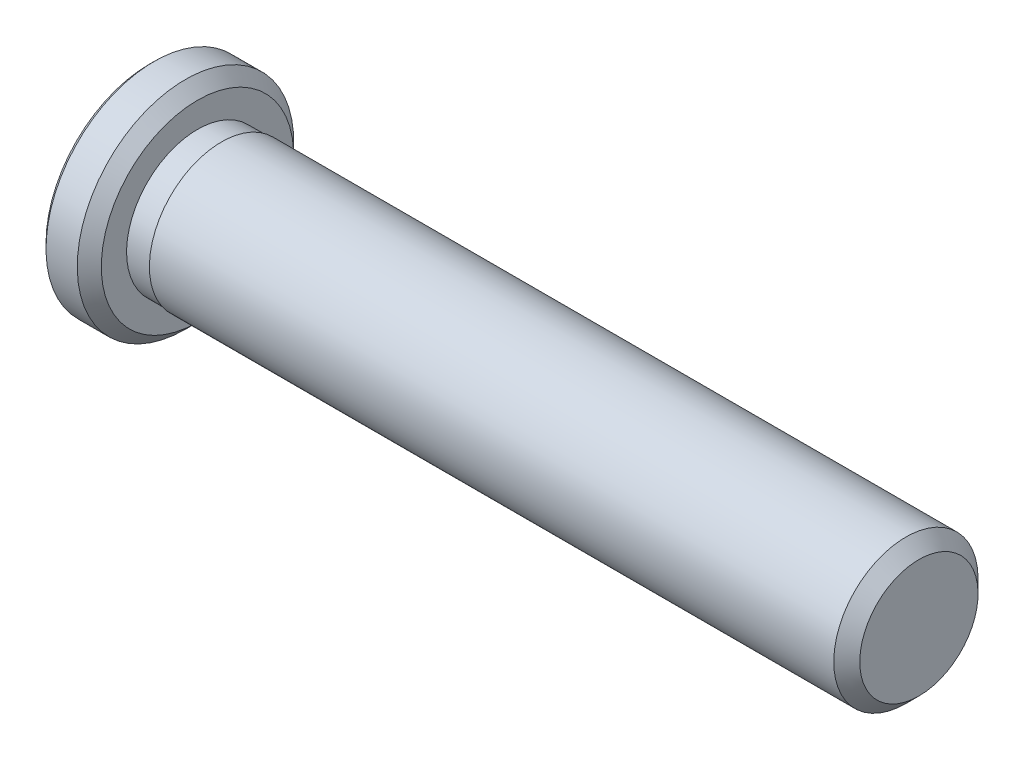
ISO-10303-21;
HEADER;
FILE_DESCRIPTION(('STEP AP214'),'2;1');
FILE_NAME('part.step','',(''),(''),'','','');
FILE_SCHEMA(('AUTOMOTIVE_DESIGN { 1 0 10303 214 1 1 1 1 }'));
ENDSEC;
DATA;
#1=APPLICATION_CONTEXT('core data for automotive mechanical design processes');
#2=APPLICATION_PROTOCOL_DEFINITION('international standard','automotive_design',2000,#1);
#3=PRODUCT_CONTEXT('',#1,'mechanical');
#4=PRODUCT('Part','Part','',(#3));
#5=PRODUCT_RELATED_PRODUCT_CATEGORY('part','',(#4));
#6=PRODUCT_DEFINITION_FORMATION('','',#4);
#7=PRODUCT_DEFINITION_CONTEXT('part definition',#1,'design');
#8=PRODUCT_DEFINITION('design','',#6,#7);
#9=PRODUCT_DEFINITION_SHAPE('','',#8);
#10=(LENGTH_UNIT() NAMED_UNIT(*) SI_UNIT(.MILLI.,.METRE.));
#11=(NAMED_UNIT(*) PLANE_ANGLE_UNIT() SI_UNIT($,.RADIAN.));
#12=(NAMED_UNIT(*) SI_UNIT($,.STERADIAN.) SOLID_ANGLE_UNIT());
#13=UNCERTAINTY_MEASURE_WITH_UNIT(LENGTH_MEASURE(1.E-05),#10,'distance_accuracy_value','');
#14=(GEOMETRIC_REPRESENTATION_CONTEXT(3) GLOBAL_UNCERTAINTY_ASSIGNED_CONTEXT((#13)) GLOBAL_UNIT_ASSIGNED_CONTEXT((#10,
#11,#12)) REPRESENTATION_CONTEXT('',''));
#15=CARTESIAN_POINT('',(0.,0.,0.));
#16=DIRECTION('',(0.,0.,1.));
#17=DIRECTION('',(1.,0.,0.));
#18=AXIS2_PLACEMENT_3D('',#15,#16,#17);
#19=CARTESIAN_POINT('',(-2.,0.,0.));
#20=DIRECTION('',(1.,0.,0.));
#21=DIRECTION('',(0.,1.,0.));
#22=AXIS2_PLACEMENT_3D('',#19,#20,#21);
#23=PLANE('',#22);
#24=DIRECTION('',(0.,0.,1.));
#25=VECTOR('',#24,1.);
#26=CARTESIAN_POINT('',(-2.,-1.5,-0.86602540378444));
#27=LINE('',#26,#25);
#28=CARTESIAN_POINT('',(-2.,-1.5,-0.86602540378444));
#29=VERTEX_POINT('',#28);
#30=CARTESIAN_POINT('',(-2.,-1.5,0.86602540378444));
#31=VERTEX_POINT('',#30);
#32=EDGE_CURVE('E105',#29,#31,#27,.T.);
#33=ORIENTED_EDGE('',*,*,#32,.F.);
#34=DIRECTION('',(0.,-0.866025403784433,0.500000000000009));
#35=VECTOR('',#34,1.);
#36=CARTESIAN_POINT('',(-2.,0.,-1.7320508075689));
#37=LINE('',#36,#35);
#38=CARTESIAN_POINT('',(-2.,0.,-1.7320508075689));
#39=VERTEX_POINT('',#38);
#40=EDGE_CURVE('E31',#39,#29,#37,.T.);
#41=ORIENTED_EDGE('',*,*,#40,.F.);
#42=DIRECTION('',(0.,-0.866025403784433,-0.500000000000009));
#43=VECTOR('',#42,1.);
#44=CARTESIAN_POINT('',(-2.,1.5,-0.86602540378444));
#45=LINE('',#44,#43);
#46=CARTESIAN_POINT('',(-2.,1.5,-0.86602540378444));
#47=VERTEX_POINT('',#46);
#48=EDGE_CURVE('E114',#47,#39,#45,.T.);
#49=ORIENTED_EDGE('',*,*,#48,.F.);
#50=DIRECTION('',(0.,0.,-1.));
#51=VECTOR('',#50,1.);
#52=CARTESIAN_POINT('',(-2.,1.5,0.86602540378444));
#53=LINE('',#52,#51);
#54=CARTESIAN_POINT('',(-2.,1.5,0.86602540378444));
#55=VERTEX_POINT('',#54);
#56=EDGE_CURVE('E112',#55,#47,#53,.T.);
#57=ORIENTED_EDGE('',*,*,#56,.F.);
#58=DIRECTION('',(0.,0.866025403784433,-0.500000000000009));
#59=VECTOR('',#58,1.);
#60=CARTESIAN_POINT('',(-2.,0.,1.7320508075689));
#61=LINE('',#60,#59);
#62=CARTESIAN_POINT('',(-2.,0.,1.7320508075689));
#63=VERTEX_POINT('',#62);
#64=EDGE_CURVE('E79',#63,#55,#61,.T.);
#65=ORIENTED_EDGE('',*,*,#64,.F.);
#66=DIRECTION('',(0.,0.866025403784433,0.500000000000009));
#67=VECTOR('',#66,1.);
#68=CARTESIAN_POINT('',(-2.,-1.5,0.86602540378444));
#69=LINE('',#68,#67);
#70=EDGE_CURVE('E108',#31,#63,#69,.T.);
#71=ORIENTED_EDGE('',*,*,#70,.F.);
#72=EDGE_LOOP('',(#33,#41,#49,#57,#65,#71));
#73=FACE_BOUND('',#72,.T.);
#74=CARTESIAN_POINT('',(-2.,0.,0.));
#75=DIRECTION('',(-1.,0.,0.));
#76=DIRECTION('',(0.,-1.,0.));
#77=AXIS2_PLACEMENT_3D('',#74,#75,#76);
#78=CIRCLE('',#77,4.3);
#79=CARTESIAN_POINT('',(-2.,-4.3,0.));
#80=VERTEX_POINT('',#79);
#81=EDGE_CURVE('E11',#80,#80,#78,.T.);
#82=ORIENTED_EDGE('',*,*,#81,.T.);
#83=EDGE_LOOP('',(#82));
#84=FACE_BOUND('',#83,.T.);
#85=ADVANCED_FACE('F17',(#73,#84),#23,.F.);
#86=CARTESIAN_POINT('',(-1.8,0.,0.));
#87=DIRECTION('',(1.,0.,0.));
#88=DIRECTION('',(0.,1.,0.));
#89=AXIS2_PLACEMENT_3D('',#86,#87,#88);
#90=CONICAL_SURFACE('',#89,4.5,0.78539816339745);
#91=ORIENTED_EDGE('',*,*,#81,.F.);
#92=EDGE_LOOP('',(#91));
#93=FACE_BOUND('',#92,.T.);
#94=CARTESIAN_POINT('',(-1.8,0.,0.));
#95=DIRECTION('',(-1.,0.,0.));
#96=DIRECTION('',(0.,-1.,0.));
#97=AXIS2_PLACEMENT_3D('',#94,#95,#96);
#98=CIRCLE('',#97,4.5);
#99=CARTESIAN_POINT('',(-1.8,-4.5,0.));
#100=VERTEX_POINT('',#99);
#101=EDGE_CURVE('E24',#100,#100,#98,.T.);
#102=ORIENTED_EDGE('',*,*,#101,.T.);
#103=EDGE_LOOP('',(#102));
#104=FACE_BOUND('',#103,.T.);
#105=ADVANCED_FACE('F146',(#93,#104),#90,.T.);
#106=CARTESIAN_POINT('',(30.,0.,0.));
#107=DIRECTION('',(-1.,0.,0.));
#108=DIRECTION('',(0.,-1.,0.));
#109=AXIS2_PLACEMENT_3D('',#106,#107,#108);
#110=CYLINDRICAL_SURFACE('',#109,4.5);
#111=ORIENTED_EDGE('',*,*,#101,.F.);
#112=EDGE_LOOP('',(#111));
#113=FACE_BOUND('',#112,.T.);
#114=CARTESIAN_POINT('',(-0.5,0.,0.));
#115=DIRECTION('',(-1.,0.,0.));
#116=DIRECTION('',(0.,-1.,0.));
#117=AXIS2_PLACEMENT_3D('',#114,#115,#116);
#118=CIRCLE('',#117,4.5);
#119=CARTESIAN_POINT('',(-0.5,-4.5,0.));
#120=VERTEX_POINT('',#119);
#121=EDGE_CURVE('E141',#120,#120,#118,.T.);
#122=ORIENTED_EDGE('',*,*,#121,.T.);
#123=EDGE_LOOP('',(#122));
#124=FACE_BOUND('',#123,.T.);
#125=ADVANCED_FACE('F148',(#113,#124),#110,.T.);
#126=CARTESIAN_POINT('',(0.,0.,0.));
#127=DIRECTION('',(-1.,0.,0.));
#128=DIRECTION('',(0.,-1.,0.));
#129=AXIS2_PLACEMENT_3D('',#126,#127,#128);
#130=CONICAL_SURFACE('',#129,4.,0.785398163397448);
#131=ORIENTED_EDGE('',*,*,#121,.F.);
#132=EDGE_LOOP('',(#131));
#133=FACE_BOUND('',#132,.T.);
#134=CARTESIAN_POINT('',(0.,0.,0.));
#135=DIRECTION('',(-1.,0.,0.));
#136=DIRECTION('',(0.,-1.,0.));
#137=AXIS2_PLACEMENT_3D('',#134,#135,#136);
#138=CIRCLE('',#137,4.);
#139=CARTESIAN_POINT('',(0.,-4.,0.));
#140=VERTEX_POINT('',#139);
#141=EDGE_CURVE('E138',#140,#140,#138,.T.);
#142=ORIENTED_EDGE('',*,*,#141,.T.);
#143=EDGE_LOOP('',(#142));
#144=FACE_BOUND('',#143,.T.);
#145=ADVANCED_FACE('F151',(#133,#144),#130,.T.);
#146=CARTESIAN_POINT('',(0.,4.,0.));
#147=DIRECTION('',(-1.,0.,0.));
#148=DIRECTION('',(0.,-1.,0.));
#149=AXIS2_PLACEMENT_3D('',#146,#147,#148);
#150=PLANE('',#149);
#151=ORIENTED_EDGE('',*,*,#141,.F.);
#152=EDGE_LOOP('',(#151));
#153=FACE_BOUND('',#152,.T.);
#154=CARTESIAN_POINT('',(0.,0.,0.));
#155=DIRECTION('',(-1.,0.,0.));
#156=DIRECTION('',(0.,-1.,0.));
#157=AXIS2_PLACEMENT_3D('',#154,#155,#156);
#158=CIRCLE('',#157,2.95);
#159=CARTESIAN_POINT('',(0.,-2.95,0.));
#160=VERTEX_POINT('',#159);
#161=EDGE_CURVE('E135',#160,#160,#158,.T.);
#162=ORIENTED_EDGE('',*,*,#161,.T.);
#163=EDGE_LOOP('',(#162));
#164=FACE_BOUND('',#163,.T.);
#165=ADVANCED_FACE('F157',(#153,#164),#150,.F.);
#166=CARTESIAN_POINT('',(30.,0.,0.));
#167=DIRECTION('',(-1.,0.,0.));
#168=DIRECTION('',(0.,-1.,0.));
#169=AXIS2_PLACEMENT_3D('',#166,#167,#168);
#170=CYLINDRICAL_SURFACE('',#169,2.95);
#171=ORIENTED_EDGE('',*,*,#161,.F.);
#172=EDGE_LOOP('',(#171));
#173=FACE_BOUND('',#172,.T.);
#174=CARTESIAN_POINT('',(1.,0.,0.));
#175=DIRECTION('',(-1.,0.,0.));
#176=DIRECTION('',(0.,-1.,0.));
#177=AXIS2_PLACEMENT_3D('',#174,#175,#176);
#178=CIRCLE('',#177,2.95);
#179=CARTESIAN_POINT('',(1.,-2.95,0.));
#180=VERTEX_POINT('',#179);
#181=EDGE_CURVE('E132',#180,#180,#178,.T.);
#182=ORIENTED_EDGE('',*,*,#181,.T.);
#183=EDGE_LOOP('',(#182));
#184=FACE_BOUND('',#183,.T.);
#185=ADVANCED_FACE('F163',(#173,#184),#170,.T.);
#186=CARTESIAN_POINT('',(1.,2.95,0.));
#187=DIRECTION('',(1.,0.,0.));
#188=DIRECTION('',(0.,1.,0.));
#189=AXIS2_PLACEMENT_3D('',#186,#187,#188);
#190=PLANE('',#189);
#191=ORIENTED_EDGE('',*,*,#181,.F.);
#192=EDGE_LOOP('',(#191));
#193=FACE_BOUND('',#192,.T.);
#194=CARTESIAN_POINT('',(1.,0.,0.));
#195=DIRECTION('',(-1.,0.,0.));
#196=DIRECTION('',(0.,-1.,0.));
#197=AXIS2_PLACEMENT_3D('',#194,#195,#196);
#198=CIRCLE('',#197,3.);
#199=CARTESIAN_POINT('',(1.,-3.,0.));
#200=VERTEX_POINT('',#199);
#201=EDGE_CURVE('E129',#200,#200,#198,.T.);
#202=ORIENTED_EDGE('',*,*,#201,.T.);
#203=EDGE_LOOP('',(#202));
#204=FACE_BOUND('',#203,.T.);
#205=ADVANCED_FACE('F169',(#193,#204),#190,.F.);
#206=CARTESIAN_POINT('',(30.,0.,0.));
#207=DIRECTION('',(-1.,0.,0.));
#208=DIRECTION('',(0.,-1.,0.));
#209=AXIS2_PLACEMENT_3D('',#206,#207,#208);
#210=CYLINDRICAL_SURFACE('',#209,3.);
#211=ORIENTED_EDGE('',*,*,#201,.F.);
#212=EDGE_LOOP('',(#211));
#213=FACE_BOUND('',#212,.T.);
#214=CARTESIAN_POINT('',(29.4585,0.,0.));
#215=DIRECTION('',(-1.,0.,0.));
#216=DIRECTION('',(0.,-1.,0.));
#217=AXIS2_PLACEMENT_3D('',#214,#215,#216);
#218=CIRCLE('',#217,3.);
#219=CARTESIAN_POINT('',(29.4585,-3.,0.));
#220=VERTEX_POINT('',#219);
#221=EDGE_CURVE('E126',#220,#220,#218,.T.);
#222=ORIENTED_EDGE('',*,*,#221,.T.);
#223=EDGE_LOOP('',(#222));
#224=FACE_BOUND('',#223,.T.);
#225=ADVANCED_FACE('F175',(#213,#224),#210,.T.);
#226=CARTESIAN_POINT('',(30.,0.,0.));
#227=DIRECTION('',(-1.,0.,0.));
#228=DIRECTION('',(0.,-1.,0.));
#229=AXIS2_PLACEMENT_3D('',#226,#227,#228);
#230=CONICAL_SURFACE('',#229,2.4585,0.785398163397448);
#231=ORIENTED_EDGE('',*,*,#221,.F.);
#232=EDGE_LOOP('',(#231));
#233=FACE_BOUND('',#232,.T.);
#234=CARTESIAN_POINT('',(30.,0.,0.));
#235=DIRECTION('',(-1.,0.,0.));
#236=DIRECTION('',(0.,-1.,0.));
#237=AXIS2_PLACEMENT_3D('',#234,#235,#236);
#238=CIRCLE('',#237,2.4585);
#239=CARTESIAN_POINT('',(30.,-2.4585,0.));
#240=VERTEX_POINT('',#239);
#241=EDGE_CURVE('E118',#240,#240,#238,.T.);
#242=ORIENTED_EDGE('',*,*,#241,.T.);
#243=EDGE_LOOP('',(#242));
#244=FACE_BOUND('',#243,.T.);
#245=ADVANCED_FACE('F181',(#233,#244),#230,.T.);
#246=CARTESIAN_POINT('',(30.,2.4585,0.));
#247=DIRECTION('',(-1.,0.,0.));
#248=DIRECTION('',(0.,-1.,0.));
#249=AXIS2_PLACEMENT_3D('',#246,#247,#248);
#250=PLANE('',#249);
#251=ORIENTED_EDGE('',*,*,#241,.F.);
#252=EDGE_LOOP('',(#251));
#253=FACE_BOUND('',#252,.T.);
#254=ADVANCED_FACE('F187',(#253),#250,.F.);
#255=CARTESIAN_POINT('',(-0.6,0.,-1.7320508075689));
#256=DIRECTION('',(0.,-0.500000000000009,-0.866025403784433));
#257=DIRECTION('',(0.,0.866025403784433,-0.500000000000009));
#258=AXIS2_PLACEMENT_3D('',#255,#256,#257);
#259=PLANE('',#258);
#260=ORIENTED_EDGE('',*,*,#40,.T.);
#261=DIRECTION('',(-1.,0.,0.));
#262=VECTOR('',#261,1.);
#263=CARTESIAN_POINT('',(-0.6,-1.5,-0.86602540378444));
#264=LINE('',#263,#262);
#265=CARTESIAN_POINT('',(-0.6,-1.5,-0.86602540378444));
#266=VERTEX_POINT('',#265);
#267=EDGE_CURVE('E61',#266,#29,#264,.T.);
#268=ORIENTED_EDGE('',*,*,#267,.F.);
#269=DIRECTION('',(0.,-0.866025403784433,0.500000000000009));
#270=VECTOR('',#269,1.);
#271=CARTESIAN_POINT('',(-0.6,0.,-1.7320508075689));
#272=LINE('',#271,#270);
#273=CARTESIAN_POINT('',(-0.6,0.,-1.7320508075689));
#274=VERTEX_POINT('',#273);
#275=EDGE_CURVE('E116',#274,#266,#272,.T.);
#276=ORIENTED_EDGE('',*,*,#275,.F.);
#277=DIRECTION('',(-1.,0.,0.));
#278=VECTOR('',#277,1.);
#279=CARTESIAN_POINT('',(-0.6,0.,-1.7320508075689));
#280=LINE('',#279,#278);
#281=EDGE_CURVE('E39',#274,#39,#280,.T.);
#282=ORIENTED_EDGE('',*,*,#281,.T.);
#283=EDGE_LOOP('',(#260,#268,#276,#282));
#284=FACE_BOUND('',#283,.T.);
#285=ADVANCED_FACE('F192',(#284),#259,.F.);
#286=CARTESIAN_POINT('',(-0.6,1.5,-0.86602540378444));
#287=DIRECTION('',(0.,0.500000000000009,-0.866025403784433));
#288=DIRECTION('',(0.,0.866025403784433,0.500000000000009));
#289=AXIS2_PLACEMENT_3D('',#286,#287,#288);
#290=PLANE('',#289);
#291=ORIENTED_EDGE('',*,*,#48,.T.);
#292=ORIENTED_EDGE('',*,*,#281,.F.);
#293=DIRECTION('',(0.,-0.866025403784433,-0.500000000000009));
#294=VECTOR('',#293,1.);
#295=CARTESIAN_POINT('',(-0.6,1.5,-0.86602540378444));
#296=LINE('',#295,#294);
#297=CARTESIAN_POINT('',(-0.6,1.5,-0.86602540378444));
#298=VERTEX_POINT('',#297);
#299=EDGE_CURVE('E91',#298,#274,#296,.T.);
#300=ORIENTED_EDGE('',*,*,#299,.F.);
#301=DIRECTION('',(-1.,0.,0.));
#302=VECTOR('',#301,1.);
#303=CARTESIAN_POINT('',(-0.6,1.5,-0.86602540378444));
#304=LINE('',#303,#302);
#305=EDGE_CURVE('E83',#298,#47,#304,.T.);
#306=ORIENTED_EDGE('',*,*,#305,.T.);
#307=EDGE_LOOP('',(#291,#292,#300,#306));
#308=FACE_BOUND('',#307,.T.);
#309=ADVANCED_FACE('F199',(#308),#290,.F.);
#310=CARTESIAN_POINT('',(-0.6,1.5,0.86602540378444));
#311=DIRECTION('',(0.,1.,0.));
#312=DIRECTION('',(0.,0.,1.));
#313=AXIS2_PLACEMENT_3D('',#310,#311,#312);
#314=PLANE('',#313);
#315=ORIENTED_EDGE('',*,*,#56,.T.);
#316=ORIENTED_EDGE('',*,*,#305,.F.);
#317=DIRECTION('',(0.,0.,-1.));
#318=VECTOR('',#317,1.);
#319=CARTESIAN_POINT('',(-0.6,1.5,0.86602540378444));
#320=LINE('',#319,#318);
#321=CARTESIAN_POINT('',(-0.6,1.5,0.86602540378444));
#322=VERTEX_POINT('',#321);
#323=EDGE_CURVE('E87',#322,#298,#320,.T.);
#324=ORIENTED_EDGE('',*,*,#323,.F.);
#325=DIRECTION('',(-1.,0.,0.));
#326=VECTOR('',#325,1.);
#327=CARTESIAN_POINT('',(-0.6,1.5,0.86602540378444));
#328=LINE('',#327,#326);
#329=EDGE_CURVE('E72',#322,#55,#328,.T.);
#330=ORIENTED_EDGE('',*,*,#329,.T.);
#331=EDGE_LOOP('',(#315,#316,#324,#330));
#332=FACE_BOUND('',#331,.T.);
#333=ADVANCED_FACE('F88',(#332),#314,.F.);
#334=CARTESIAN_POINT('',(-0.6,0.,1.7320508075689));
#335=DIRECTION('',(0.,0.500000000000009,0.866025403784433));
#336=DIRECTION('',(0.,-0.866025403784433,0.500000000000009));
#337=AXIS2_PLACEMENT_3D('',#334,#335,#336);
#338=PLANE('',#337);
#339=ORIENTED_EDGE('',*,*,#64,.T.);
#340=ORIENTED_EDGE('',*,*,#329,.F.);
#341=DIRECTION('',(0.,0.866025403784433,-0.500000000000009));
#342=VECTOR('',#341,1.);
#343=CARTESIAN_POINT('',(-0.6,0.,1.7320508075689));
#344=LINE('',#343,#342);
#345=CARTESIAN_POINT('',(-0.6,0.,1.7320508075689));
#346=VERTEX_POINT('',#345);
#347=EDGE_CURVE('E76',#346,#322,#344,.T.);
#348=ORIENTED_EDGE('',*,*,#347,.F.);
#349=DIRECTION('',(-1.,0.,0.));
#350=VECTOR('',#349,1.);
#351=CARTESIAN_POINT('',(-0.6,0.,1.7320508075689));
#352=LINE('',#351,#350);
#353=EDGE_CURVE('E84',#346,#63,#352,.T.);
#354=ORIENTED_EDGE('',*,*,#353,.T.);
#355=EDGE_LOOP('',(#339,#340,#348,#354));
#356=FACE_BOUND('',#355,.T.);
#357=ADVANCED_FACE('F74',(#356),#338,.F.);
#358=CARTESIAN_POINT('',(-0.6,-1.5,0.86602540378444));
#359=DIRECTION('',(0.,-0.500000000000009,0.866025403784433));
#360=DIRECTION('',(0.,-0.866025403784433,-0.500000000000009));
#361=AXIS2_PLACEMENT_3D('',#358,#359,#360);
#362=PLANE('',#361);
#363=ORIENTED_EDGE('',*,*,#70,.T.);
#364=ORIENTED_EDGE('',*,*,#353,.F.);
#365=DIRECTION('',(0.,0.866025403784433,0.500000000000009));
#366=VECTOR('',#365,1.);
#367=CARTESIAN_POINT('',(-0.6,-1.5,0.86602540378444));
#368=LINE('',#367,#366);
#369=CARTESIAN_POINT('',(-0.6,-1.5,0.86602540378444));
#370=VERTEX_POINT('',#369);
#371=EDGE_CURVE('E97',#370,#346,#368,.T.);
#372=ORIENTED_EDGE('',*,*,#371,.F.);
#373=DIRECTION('',(-1.,0.,0.));
#374=VECTOR('',#373,1.);
#375=CARTESIAN_POINT('',(-0.6,-1.5,0.86602540378444));
#376=LINE('',#375,#374);
#377=EDGE_CURVE('E121',#370,#31,#376,.T.);
#378=ORIENTED_EDGE('',*,*,#377,.T.);
#379=EDGE_LOOP('',(#363,#364,#372,#378));
#380=FACE_BOUND('',#379,.T.);
#381=ADVANCED_FACE('F227',(#380),#362,.F.);
#382=CARTESIAN_POINT('',(-0.6,-1.5,-0.86602540378444));
#383=DIRECTION('',(0.,-1.,0.));
#384=DIRECTION('',(0.,0.,-1.));
#385=AXIS2_PLACEMENT_3D('',#382,#383,#384);
#386=PLANE('',#385);
#387=ORIENTED_EDGE('',*,*,#32,.T.);
#388=ORIENTED_EDGE('',*,*,#377,.F.);
#389=DIRECTION('',(0.,0.,1.));
#390=VECTOR('',#389,1.);
#391=CARTESIAN_POINT('',(-0.6,-1.5,-0.86602540378444));
#392=LINE('',#391,#390);
#393=EDGE_CURVE('E99',#266,#370,#392,.T.);
#394=ORIENTED_EDGE('',*,*,#393,.F.);
#395=ORIENTED_EDGE('',*,*,#267,.T.);
#396=EDGE_LOOP('',(#387,#388,#394,#395));
#397=FACE_BOUND('',#396,.T.);
#398=ADVANCED_FACE('F214',(#397),#386,.F.);
#399=CARTESIAN_POINT('',(-0.6,-1.5,-0.86602540378444));
#400=DIRECTION('',(-1.,0.,0.));
#401=DIRECTION('',(0.,0.,1.));
#402=AXIS2_PLACEMENT_3D('',#399,#400,#401);
#403=PLANE('',#402);
#404=ORIENTED_EDGE('',*,*,#275,.T.);
#405=ORIENTED_EDGE('',*,*,#393,.T.);
#406=ORIENTED_EDGE('',*,*,#371,.T.);
#407=ORIENTED_EDGE('',*,*,#347,.T.);
#408=ORIENTED_EDGE('',*,*,#323,.T.);
#409=ORIENTED_EDGE('',*,*,#299,.T.);
#410=EDGE_LOOP('',(#404,#405,#406,#407,#408,#409));
#411=FACE_BOUND('',#410,.T.);
#412=ADVANCED_FACE('F94',(#411),#403,.T.);
#413=CLOSED_SHELL('',(#85,#105,#125,#145,#165,#185,#205,#225,#245,#254,#285,#309,#333,#357,#381,
#398,#412));
#414=MANIFOLD_SOLID_BREP('B1',#413);
#415=ADVANCED_BREP_SHAPE_REPRESENTATION('',(#18,#414),#14);
#416=SHAPE_DEFINITION_REPRESENTATION(#9,#415);
ENDSEC;
END-ISO-10303-21;
